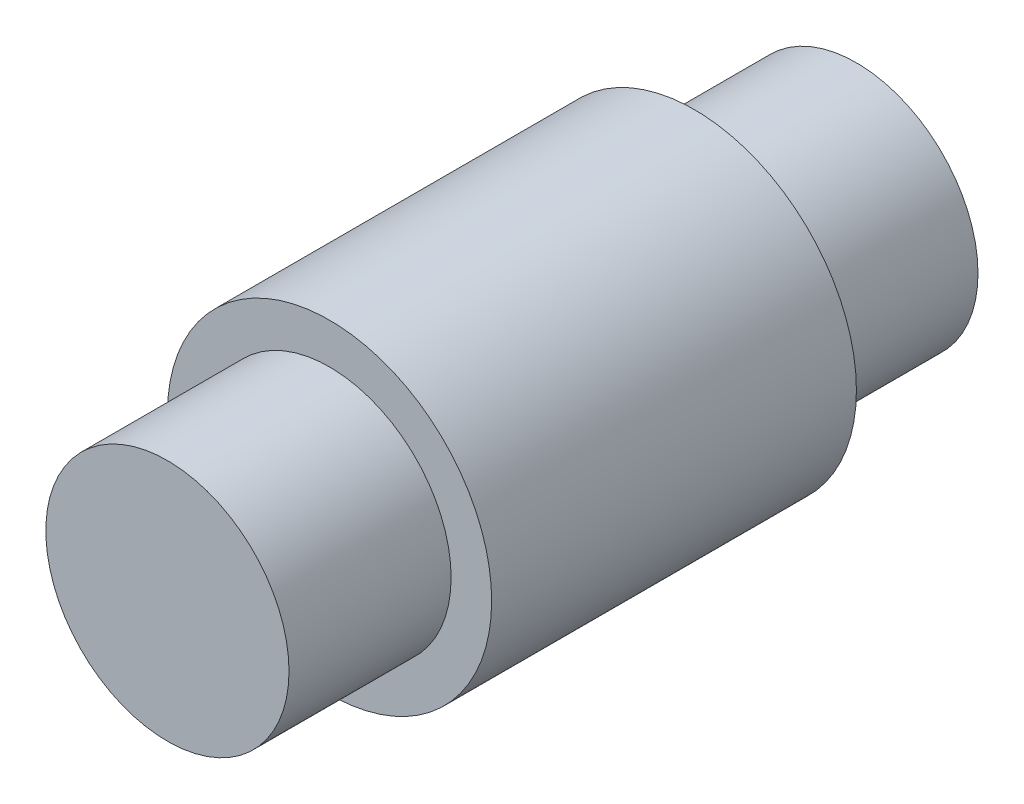
ISO-10303-21;
HEADER;
FILE_DESCRIPTION(('STEP AP214'),'2;1');
FILE_NAME('part.step','',(''),(''),'','','');
FILE_SCHEMA(('AUTOMOTIVE_DESIGN { 1 0 10303 214 1 1 1 1 }'));
ENDSEC;
DATA;
#1=APPLICATION_CONTEXT('core data for automotive mechanical design processes');
#2=APPLICATION_PROTOCOL_DEFINITION('international standard','automotive_design',2000,#1);
#3=PRODUCT_CONTEXT('',#1,'mechanical');
#4=PRODUCT('Part','Part','',(#3));
#5=PRODUCT_RELATED_PRODUCT_CATEGORY('part','',(#4));
#6=PRODUCT_DEFINITION_FORMATION('','',#4);
#7=PRODUCT_DEFINITION_CONTEXT('part definition',#1,'design');
#8=PRODUCT_DEFINITION('design','',#6,#7);
#9=PRODUCT_DEFINITION_SHAPE('','',#8);
#10=(LENGTH_UNIT() NAMED_UNIT(*) SI_UNIT(.MILLI.,.METRE.));
#11=(NAMED_UNIT(*) PLANE_ANGLE_UNIT() SI_UNIT($,.RADIAN.));
#12=(NAMED_UNIT(*) SI_UNIT($,.STERADIAN.) SOLID_ANGLE_UNIT());
#13=UNCERTAINTY_MEASURE_WITH_UNIT(LENGTH_MEASURE(1.E-05),#10,'distance_accuracy_value','');
#14=(GEOMETRIC_REPRESENTATION_CONTEXT(3) GLOBAL_UNCERTAINTY_ASSIGNED_CONTEXT((#13)) GLOBAL_UNIT_ASSIGNED_CONTEXT((#10,
#11,#12)) REPRESENTATION_CONTEXT('',''));
#15=CARTESIAN_POINT('',(0.,0.,0.));
#16=DIRECTION('',(0.,0.,1.));
#17=DIRECTION('',(1.,0.,0.));
#18=AXIS2_PLACEMENT_3D('',#15,#16,#17);
#19=CARTESIAN_POINT('',(0.,0.,2.25));
#20=DIRECTION('',(0.,0.,-1.));
#21=DIRECTION('',(-1.,0.,0.));
#22=AXIS2_PLACEMENT_3D('',#19,#20,#21);
#23=CYLINDRICAL_SURFACE('',#22,2.);
#24=CARTESIAN_POINT('',(0.,0.,2.25));
#25=DIRECTION('',(0.,0.,1.));
#26=DIRECTION('',(1.,0.,0.));
#27=AXIS2_PLACEMENT_3D('',#24,#25,#26);
#28=CIRCLE('',#27,2.);
#29=CARTESIAN_POINT('',(2.,0.,2.25));
#30=VERTEX_POINT('',#29);
#31=EDGE_CURVE('E37',#30,#30,#28,.T.);
#32=ORIENTED_EDGE('',*,*,#31,.F.);
#33=EDGE_LOOP('',(#32));
#34=FACE_BOUND('',#33,.T.);
#35=CARTESIAN_POINT('',(0.,0.,-2.25));
#36=DIRECTION('',(0.,0.,1.));
#37=DIRECTION('',(1.,0.,0.));
#38=AXIS2_PLACEMENT_3D('',#35,#36,#37);
#39=CIRCLE('',#38,2.);
#40=CARTESIAN_POINT('',(2.,0.,-2.25));
#41=VERTEX_POINT('',#40);
#42=EDGE_CURVE('E49',#41,#41,#39,.T.);
#43=ORIENTED_EDGE('',*,*,#42,.T.);
#44=EDGE_LOOP('',(#43));
#45=FACE_BOUND('',#44,.T.);
#46=ADVANCED_FACE('F31',(#34,#45),#23,.T.);
#47=CARTESIAN_POINT('',(0.,0.,2.25));
#48=DIRECTION('',(0.,0.,1.));
#49=DIRECTION('',(1.,0.,0.));
#50=AXIS2_PLACEMENT_3D('',#47,#48,#49);
#51=PLANE('',#50);
#52=CARTESIAN_POINT('',(0.,0.,2.25));
#53=DIRECTION('',(0.,0.,1.));
#54=DIRECTION('',(1.,0.,0.));
#55=AXIS2_PLACEMENT_3D('',#52,#53,#54);
#56=CIRCLE('',#55,1.5);
#57=CARTESIAN_POINT('',(1.5,0.,2.25));
#58=VERTEX_POINT('',#57);
#59=EDGE_CURVE('E45',#58,#58,#56,.T.);
#60=ORIENTED_EDGE('',*,*,#59,.F.);
#61=EDGE_LOOP('',(#60));
#62=FACE_BOUND('',#61,.T.);
#63=ORIENTED_EDGE('',*,*,#31,.T.);
#64=EDGE_LOOP('',(#63));
#65=FACE_BOUND('',#64,.T.);
#66=ADVANCED_FACE('F68',(#62,#65),#51,.T.);
#67=CARTESIAN_POINT('',(0.,0.,4.25));
#68=DIRECTION('',(0.,0.,-1.));
#69=DIRECTION('',(-1.,0.,0.));
#70=AXIS2_PLACEMENT_3D('',#67,#68,#69);
#71=CYLINDRICAL_SURFACE('',#70,1.5);
#72=CARTESIAN_POINT('',(0.,0.,4.25));
#73=DIRECTION('',(0.,0.,1.));
#74=DIRECTION('',(1.,0.,0.));
#75=AXIS2_PLACEMENT_3D('',#72,#73,#74);
#76=CIRCLE('',#75,1.5);
#77=CARTESIAN_POINT('',(1.5,0.,4.25));
#78=VERTEX_POINT('',#77);
#79=EDGE_CURVE('E41',#78,#78,#76,.T.);
#80=ORIENTED_EDGE('',*,*,#79,.F.);
#81=EDGE_LOOP('',(#80));
#82=FACE_BOUND('',#81,.T.);
#83=ORIENTED_EDGE('',*,*,#59,.T.);
#84=EDGE_LOOP('',(#83));
#85=FACE_BOUND('',#84,.T.);
#86=ADVANCED_FACE('F73',(#82,#85),#71,.T.);
#87=CARTESIAN_POINT('',(0.,0.,4.25));
#88=DIRECTION('',(0.,0.,1.));
#89=DIRECTION('',(1.,0.,0.));
#90=AXIS2_PLACEMENT_3D('',#87,#88,#89);
#91=PLANE('',#90);
#92=ORIENTED_EDGE('',*,*,#79,.T.);
#93=EDGE_LOOP('',(#92));
#94=FACE_BOUND('',#93,.T.);
#95=ADVANCED_FACE('F79',(#94),#91,.T.);
#96=CARTESIAN_POINT('',(0.,0.,-2.25));
#97=DIRECTION('',(0.,0.,-1.));
#98=DIRECTION('',(1.,0.,0.));
#99=AXIS2_PLACEMENT_3D('',#96,#97,#98);
#100=PLANE('',#99);
#101=CARTESIAN_POINT('',(0.,0.,-2.25));
#102=DIRECTION('',(0.,0.,-1.));
#103=DIRECTION('',(-1.,0.,0.));
#104=AXIS2_PLACEMENT_3D('',#101,#102,#103);
#105=CIRCLE('',#104,1.5);
#106=CARTESIAN_POINT('',(-1.5,0.,-2.25));
#107=VERTEX_POINT('',#106);
#108=EDGE_CURVE('E10',#107,#107,#105,.T.);
#109=ORIENTED_EDGE('',*,*,#108,.F.);
#110=EDGE_LOOP('',(#109));
#111=FACE_BOUND('',#110,.T.);
#112=ORIENTED_EDGE('',*,*,#42,.F.);
#113=EDGE_LOOP('',(#112));
#114=FACE_BOUND('',#113,.T.);
#115=ADVANCED_FACE('F65',(#111,#114),#100,.T.);
#116=CARTESIAN_POINT('',(0.,0.,-4.25));
#117=DIRECTION('',(0.,0.,1.));
#118=DIRECTION('',(1.,0.,0.));
#119=AXIS2_PLACEMENT_3D('',#116,#117,#118);
#120=CYLINDRICAL_SURFACE('',#119,1.5);
#121=CARTESIAN_POINT('',(0.,0.,-4.25));
#122=DIRECTION('',(0.,0.,1.));
#123=DIRECTION('',(1.,0.,0.));
#124=AXIS2_PLACEMENT_3D('',#121,#122,#123);
#125=CIRCLE('',#124,1.5);
#126=CARTESIAN_POINT('',(1.5,0.,-4.25));
#127=VERTEX_POINT('',#126);
#128=EDGE_CURVE('E53',#127,#127,#125,.T.);
#129=ORIENTED_EDGE('',*,*,#128,.T.);
#130=EDGE_LOOP('',(#129));
#131=FACE_BOUND('',#130,.T.);
#132=ORIENTED_EDGE('',*,*,#108,.T.);
#133=EDGE_LOOP('',(#132));
#134=FACE_BOUND('',#133,.T.);
#135=ADVANCED_FACE('F57',(#131,#134),#120,.T.);
#136=CARTESIAN_POINT('',(0.,0.,-4.25));
#137=DIRECTION('',(0.,0.,-1.));
#138=DIRECTION('',(1.,0.,0.));
#139=AXIS2_PLACEMENT_3D('',#136,#137,#138);
#140=PLANE('',#139);
#141=ORIENTED_EDGE('',*,*,#128,.F.);
#142=EDGE_LOOP('',(#141));
#143=FACE_BOUND('',#142,.T.);
#144=ADVANCED_FACE('F59',(#143),#140,.T.);
#145=CLOSED_SHELL('',(#46,#66,#86,#95,#115,#135,#144));
#146=MANIFOLD_SOLID_BREP('B2',#145);
#147=ADVANCED_BREP_SHAPE_REPRESENTATION('',(#18,#146),#14);
#148=SHAPE_DEFINITION_REPRESENTATION(#9,#147);
ENDSEC;
END-ISO-10303-21;
